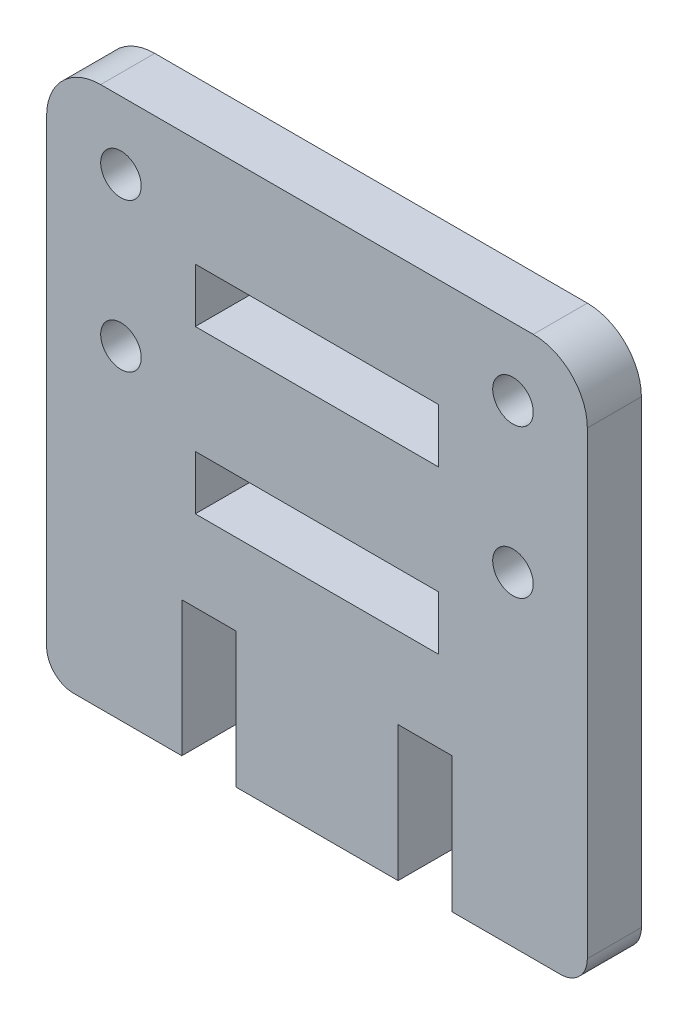
ISO-10303-21;
HEADER;
FILE_DESCRIPTION(('STEP AP214'),'2;1');
FILE_NAME('part.step','',(''),(''),'','','');
FILE_SCHEMA(('AUTOMOTIVE_DESIGN { 1 0 10303 214 1 1 1 1 }'));
ENDSEC;
DATA;
#1=APPLICATION_CONTEXT('core data for automotive mechanical design processes');
#2=APPLICATION_PROTOCOL_DEFINITION('international standard','automotive_design',2000,#1);
#3=PRODUCT_CONTEXT('',#1,'mechanical');
#4=PRODUCT('Part','Part','',(#3));
#5=PRODUCT_RELATED_PRODUCT_CATEGORY('part','',(#4));
#6=PRODUCT_DEFINITION_FORMATION('','',#4);
#7=PRODUCT_DEFINITION_CONTEXT('part definition',#1,'design');
#8=PRODUCT_DEFINITION('design','',#6,#7);
#9=PRODUCT_DEFINITION_SHAPE('','',#8);
#10=(LENGTH_UNIT() NAMED_UNIT(*) SI_UNIT(.MILLI.,.METRE.));
#11=(NAMED_UNIT(*) PLANE_ANGLE_UNIT() SI_UNIT($,.RADIAN.));
#12=(NAMED_UNIT(*) SI_UNIT($,.STERADIAN.) SOLID_ANGLE_UNIT());
#13=UNCERTAINTY_MEASURE_WITH_UNIT(LENGTH_MEASURE(1.E-05),#10,'distance_accuracy_value','');
#14=(GEOMETRIC_REPRESENTATION_CONTEXT(3) GLOBAL_UNCERTAINTY_ASSIGNED_CONTEXT((#13)) GLOBAL_UNIT_ASSIGNED_CONTEXT((#10,
#11,#12)) REPRESENTATION_CONTEXT('',''));
#15=CARTESIAN_POINT('',(0.,0.,0.));
#16=DIRECTION('',(0.,0.,1.));
#17=DIRECTION('',(1.,0.,0.));
#18=AXIS2_PLACEMENT_3D('',#15,#16,#17);
#19=CARTESIAN_POINT('',(1984.10984128656,1167.28470507667,2.));
#20=DIRECTION('',(0.,0.,1.));
#21=DIRECTION('',(1.,0.,0.));
#22=AXIS2_PLACEMENT_3D('',#19,#20,#21);
#23=PLANE('',#22);
#24=DIRECTION('',(1.,0.,0.));
#25=VECTOR('',#24,1.);
#26=CARTESIAN_POINT('',(1970.60984128656,1180.28470507667,2.));
#27=LINE('',#26,#25);
#28=CARTESIAN_POINT('',(1970.60984128656,1180.28470507667,2.));
#29=VERTEX_POINT('',#28);
#30=CARTESIAN_POINT('',(1979.60984128656,1180.28470507667,2.));
#31=VERTEX_POINT('',#30);
#32=EDGE_CURVE('E231',#29,#31,#27,.T.);
#33=ORIENTED_EDGE('',*,*,#32,.F.);
#34=DIRECTION('',(-1.11022302462516E-13,-1.,0.));
#35=VECTOR('',#34,1.);
#36=CARTESIAN_POINT('',(1970.60984128656,1180.28470507667,2.));
#37=LINE('',#36,#35);
#38=CARTESIAN_POINT('',(1970.60984128656,1182.28470507667,2.));
#39=VERTEX_POINT('',#38);
#40=EDGE_CURVE('E229',#39,#29,#37,.T.);
#41=ORIENTED_EDGE('',*,*,#40,.F.);
#42=DIRECTION('',(-1.,0.,0.));
#43=VECTOR('',#42,1.);
#44=CARTESIAN_POINT('',(1970.60984128656,1182.28470507667,2.));
#45=LINE('',#44,#43);
#46=CARTESIAN_POINT('',(1979.60984128656,1182.28470507667,2.));
#47=VERTEX_POINT('',#46);
#48=EDGE_CURVE('E237',#47,#39,#45,.T.);
#49=ORIENTED_EDGE('',*,*,#48,.F.);
#50=DIRECTION('',(0.,1.,0.));
#51=VECTOR('',#50,1.);
#52=CARTESIAN_POINT('',(1979.60984128656,1180.28470507667,2.));
#53=LINE('',#52,#51);
#54=EDGE_CURVE('E234',#31,#47,#53,.T.);
#55=ORIENTED_EDGE('',*,*,#54,.F.);
#56=EDGE_LOOP('',(#33,#41,#49,#55));
#57=FACE_BOUND('',#56,.T.);
#58=CARTESIAN_POINT('',(1982.35984128656,1178.28470507667,2.));
#59=DIRECTION('',(0.,0.,1.));
#60=DIRECTION('',(1.,0.,0.));
#61=AXIS2_PLACEMENT_3D('',#58,#59,#60);
#62=CIRCLE('',#61,0.750000000000028);
#63=CARTESIAN_POINT('',(1983.10984128656,1178.28470507667,2.));
#64=VERTEX_POINT('',#63);
#65=EDGE_CURVE('E266',#64,#64,#62,.T.);
#66=ORIENTED_EDGE('',*,*,#65,.F.);
#67=EDGE_LOOP('',(#66));
#68=FACE_BOUND('',#67,.T.);
#69=CARTESIAN_POINT('',(1982.35984128656,1183.78470507667,2.));
#70=DIRECTION('',(0.,0.,1.));
#71=DIRECTION('',(1.,0.,0.));
#72=AXIS2_PLACEMENT_3D('',#69,#70,#71);
#73=CIRCLE('',#72,0.750000000000028);
#74=CARTESIAN_POINT('',(1983.10984128656,1183.78470507667,2.));
#75=VERTEX_POINT('',#74);
#76=EDGE_CURVE('E278',#75,#75,#73,.T.);
#77=ORIENTED_EDGE('',*,*,#76,.F.);
#78=EDGE_LOOP('',(#77));
#79=FACE_BOUND('',#78,.T.);
#80=CARTESIAN_POINT('',(1984.10984128656,1167.28470507667,2.));
#81=DIRECTION('',(0.,0.,1.));
#82=DIRECTION('',(1.,0.,0.));
#83=AXIS2_PLACEMENT_3D('',#80,#81,#82);
#84=CIRCLE('',#83,1.);
#85=CARTESIAN_POINT('',(1984.10984128656,1166.28470507667,2.));
#86=VERTEX_POINT('',#85);
#87=CARTESIAN_POINT('',(1985.10984128656,1167.28470507667,2.));
#88=VERTEX_POINT('',#87);
#89=EDGE_CURVE('E284',#86,#88,#84,.T.);
#90=ORIENTED_EDGE('',*,*,#89,.T.);
#91=DIRECTION('',(0.,1.,0.));
#92=VECTOR('',#91,1.);
#93=CARTESIAN_POINT('',(1985.10984128656,1184.28470507667,2.));
#94=LINE('',#93,#92);
#95=CARTESIAN_POINT('',(1985.10984128656,1184.28470507667,2.));
#96=VERTEX_POINT('',#95);
#97=EDGE_CURVE('E287',#88,#96,#94,.T.);
#98=ORIENTED_EDGE('',*,*,#97,.T.);
#99=CARTESIAN_POINT('',(1983.10984128656,1184.28470507667,2.));
#100=DIRECTION('',(0.,0.,1.));
#101=DIRECTION('',(1.,0.,0.));
#102=AXIS2_PLACEMENT_3D('',#99,#100,#101);
#103=CIRCLE('',#102,2.00000000000011);
#104=CARTESIAN_POINT('',(1983.10984128656,1186.28470507667,2.));
#105=VERTEX_POINT('',#104);
#106=EDGE_CURVE('E290',#96,#105,#103,.T.);
#107=ORIENTED_EDGE('',*,*,#106,.T.);
#108=DIRECTION('',(-1.,0.,0.));
#109=VECTOR('',#108,1.);
#110=CARTESIAN_POINT('',(1967.10984128656,1186.28470507667,2.));
#111=LINE('',#110,#109);
#112=CARTESIAN_POINT('',(1967.10984128656,1186.28470507667,2.));
#113=VERTEX_POINT('',#112);
#114=EDGE_CURVE('E292',#105,#113,#111,.T.);
#115=ORIENTED_EDGE('',*,*,#114,.T.);
#116=CARTESIAN_POINT('',(1967.10984128656,1184.28470507667,2.));
#117=DIRECTION('',(0.,0.,1.));
#118=DIRECTION('',(1.,0.,0.));
#119=AXIS2_PLACEMENT_3D('',#116,#117,#118);
#120=CIRCLE('',#119,2.);
#121=CARTESIAN_POINT('',(1965.10984128656,1184.28470507667,2.));
#122=VERTEX_POINT('',#121);
#123=EDGE_CURVE('E294',#113,#122,#120,.T.);
#124=ORIENTED_EDGE('',*,*,#123,.T.);
#125=DIRECTION('',(0.,-1.,0.));
#126=VECTOR('',#125,1.);
#127=CARTESIAN_POINT('',(1965.10984128656,1184.28470507667,2.));
#128=LINE('',#127,#126);
#129=CARTESIAN_POINT('',(1965.10984128656,1167.28470507667,2.));
#130=VERTEX_POINT('',#129);
#131=EDGE_CURVE('E296',#122,#130,#128,.T.);
#132=ORIENTED_EDGE('',*,*,#131,.T.);
#133=CARTESIAN_POINT('',(1966.10984128656,1167.28470507667,2.));
#134=DIRECTION('',(0.,0.,1.));
#135=DIRECTION('',(1.,0.,0.));
#136=AXIS2_PLACEMENT_3D('',#133,#134,#135);
#137=CIRCLE('',#136,0.99999999999989);
#138=CARTESIAN_POINT('',(1966.10984128656,1166.28470507667,2.));
#139=VERTEX_POINT('',#138);
#140=EDGE_CURVE('E298',#130,#139,#137,.T.);
#141=ORIENTED_EDGE('',*,*,#140,.T.);
#142=DIRECTION('',(1.,0.,0.));
#143=VECTOR('',#142,1.);
#144=CARTESIAN_POINT('',(1966.10984128656,1166.28470507667,2.));
#145=LINE('',#144,#143);
#146=CARTESIAN_POINT('',(1970.10984128656,1166.28470507667,2.));
#147=VERTEX_POINT('',#146);
#148=EDGE_CURVE('E300',#139,#147,#145,.T.);
#149=ORIENTED_EDGE('',*,*,#148,.T.);
#150=DIRECTION('',(0.,1.,0.));
#151=VECTOR('',#150,1.);
#152=CARTESIAN_POINT('',(1970.10984128656,1171.28470507667,2.));
#153=LINE('',#152,#151);
#154=CARTESIAN_POINT('',(1970.10984128656,1171.28470507667,2.));
#155=VERTEX_POINT('',#154);
#156=EDGE_CURVE('E302',#147,#155,#153,.T.);
#157=ORIENTED_EDGE('',*,*,#156,.T.);
#158=DIRECTION('',(1.,0.,0.));
#159=VECTOR('',#158,1.);
#160=CARTESIAN_POINT('',(1972.10984128656,1171.28470507667,2.));
#161=LINE('',#160,#159);
#162=CARTESIAN_POINT('',(1972.10984128656,1171.28470507667,2.));
#163=VERTEX_POINT('',#162);
#164=EDGE_CURVE('E304',#155,#163,#161,.T.);
#165=ORIENTED_EDGE('',*,*,#164,.T.);
#166=DIRECTION('',(0.,-1.,0.));
#167=VECTOR('',#166,1.);
#168=CARTESIAN_POINT('',(1972.10984128656,1171.28470507667,2.));
#169=LINE('',#168,#167);
#170=CARTESIAN_POINT('',(1972.10984128656,1166.28470507667,2.));
#171=VERTEX_POINT('',#170);
#172=EDGE_CURVE('E306',#163,#171,#169,.T.);
#173=ORIENTED_EDGE('',*,*,#172,.T.);
#174=DIRECTION('',(1.,0.,0.));
#175=VECTOR('',#174,1.);
#176=CARTESIAN_POINT('',(1972.10984128656,1166.28470507667,2.));
#177=LINE('',#176,#175);
#178=CARTESIAN_POINT('',(1978.10984128656,1166.28470507667,2.));
#179=VERTEX_POINT('',#178);
#180=EDGE_CURVE('E308',#171,#179,#177,.T.);
#181=ORIENTED_EDGE('',*,*,#180,.T.);
#182=DIRECTION('',(0.,1.,0.));
#183=VECTOR('',#182,1.);
#184=CARTESIAN_POINT('',(1978.10984128656,1171.28470507667,2.));
#185=LINE('',#184,#183);
#186=CARTESIAN_POINT('',(1978.10984128656,1171.28470507667,2.));
#187=VERTEX_POINT('',#186);
#188=EDGE_CURVE('E310',#179,#187,#185,.T.);
#189=ORIENTED_EDGE('',*,*,#188,.T.);
#190=DIRECTION('',(1.,0.,0.));
#191=VECTOR('',#190,1.);
#192=CARTESIAN_POINT('',(1978.10984128656,1171.28470507667,2.));
#193=LINE('',#192,#191);
#194=CARTESIAN_POINT('',(1980.10984128656,1171.28470507667,2.));
#195=VERTEX_POINT('',#194);
#196=EDGE_CURVE('E312',#187,#195,#193,.T.);
#197=ORIENTED_EDGE('',*,*,#196,.T.);
#198=DIRECTION('',(0.,-1.,0.));
#199=VECTOR('',#198,1.);
#200=CARTESIAN_POINT('',(1980.10984128656,1171.28470507667,2.));
#201=LINE('',#200,#199);
#202=CARTESIAN_POINT('',(1980.10984128656,1166.28470507667,2.));
#203=VERTEX_POINT('',#202);
#204=EDGE_CURVE('E314',#195,#203,#201,.T.);
#205=ORIENTED_EDGE('',*,*,#204,.T.);
#206=DIRECTION('',(1.,0.,0.));
#207=VECTOR('',#206,1.);
#208=CARTESIAN_POINT('',(1980.10984128656,1166.28470507667,2.));
#209=LINE('',#208,#207);
#210=EDGE_CURVE('E316',#203,#86,#209,.T.);
#211=ORIENTED_EDGE('',*,*,#210,.T.);
#212=EDGE_LOOP('',(#90,#98,#107,#115,#124,#132,#141,#149,#157,#165,#173,#181,#189,#197,#205,#211));
#213=FACE_BOUND('',#212,.T.);
#214=CARTESIAN_POINT('',(1967.85984128656,1183.78470507667,2.));
#215=DIRECTION('',(0.,0.,1.));
#216=DIRECTION('',(1.,0.,0.));
#217=AXIS2_PLACEMENT_3D('',#214,#215,#216);
#218=CIRCLE('',#217,0.750000000000028);
#219=CARTESIAN_POINT('',(1968.60984128656,1183.78470507667,2.));
#220=VERTEX_POINT('',#219);
#221=EDGE_CURVE('E272',#220,#220,#218,.T.);
#222=ORIENTED_EDGE('',*,*,#221,.F.);
#223=EDGE_LOOP('',(#222));
#224=FACE_BOUND('',#223,.T.);
#225=CARTESIAN_POINT('',(1967.85984128656,1178.28470507667,2.));
#226=DIRECTION('',(0.,0.,1.));
#227=DIRECTION('',(1.,0.,0.));
#228=AXIS2_PLACEMENT_3D('',#225,#226,#227);
#229=CIRCLE('',#228,0.750000000000028);
#230=CARTESIAN_POINT('',(1968.60984128656,1178.28470507667,2.));
#231=VERTEX_POINT('',#230);
#232=EDGE_CURVE('E260',#231,#231,#229,.T.);
#233=ORIENTED_EDGE('',*,*,#232,.F.);
#234=EDGE_LOOP('',(#233));
#235=FACE_BOUND('',#234,.T.);
#236=DIRECTION('',(1.,0.,0.));
#237=VECTOR('',#236,1.);
#238=CARTESIAN_POINT('',(1970.60984128656,1174.28470507667,2.));
#239=LINE('',#238,#237);
#240=CARTESIAN_POINT('',(1970.60984128656,1174.28470507667,2.));
#241=VERTEX_POINT('',#240);
#242=CARTESIAN_POINT('',(1979.60984128656,1174.28470507667,2.));
#243=VERTEX_POINT('',#242);
#244=EDGE_CURVE('E201',#241,#243,#239,.T.);
#245=ORIENTED_EDGE('',*,*,#244,.F.);
#246=DIRECTION('',(1.11022302462516E-13,-1.,0.));
#247=VECTOR('',#246,1.);
#248=CARTESIAN_POINT('',(1970.60984128656,1174.28470507667,2.));
#249=LINE('',#248,#247);
#250=CARTESIAN_POINT('',(1970.60984128656,1176.28470507667,2.));
#251=VERTEX_POINT('',#250);
#252=EDGE_CURVE('E193',#251,#241,#249,.T.);
#253=ORIENTED_EDGE('',*,*,#252,.F.);
#254=DIRECTION('',(-1.,0.,0.));
#255=VECTOR('',#254,1.);
#256=CARTESIAN_POINT('',(1970.60984128656,1176.28470507667,2.));
#257=LINE('',#256,#255);
#258=CARTESIAN_POINT('',(1979.60984128656,1176.28470507667,2.));
#259=VERTEX_POINT('',#258);
#260=EDGE_CURVE('E215',#259,#251,#257,.T.);
#261=ORIENTED_EDGE('',*,*,#260,.F.);
#262=DIRECTION('',(1.11022302462516E-13,1.,0.));
#263=VECTOR('',#262,1.);
#264=CARTESIAN_POINT('',(1979.60984128656,1174.28470507667,2.));
#265=LINE('',#264,#263);
#266=EDGE_CURVE('E213',#243,#259,#265,.T.);
#267=ORIENTED_EDGE('',*,*,#266,.F.);
#268=EDGE_LOOP('',(#245,#253,#261,#267));
#269=FACE_BOUND('',#268,.T.);
#270=ADVANCED_FACE('F32',(#57,#68,#79,#213,#224,#235,#269),#23,.T.);
#271=CARTESIAN_POINT('',(1984.10984128656,1167.28470507667,0.));
#272=DIRECTION('',(0.,0.,1.));
#273=DIRECTION('',(1.,0.,0.));
#274=AXIS2_PLACEMENT_3D('',#271,#272,#273);
#275=PLANE('',#274);
#276=DIRECTION('',(-1.11022302462516E-13,-1.,0.));
#277=VECTOR('',#276,1.);
#278=CARTESIAN_POINT('',(1970.60984128656,1180.28470507667,0.));
#279=LINE('',#278,#277);
#280=CARTESIAN_POINT('',(1970.60984128656,1182.28470507667,0.));
#281=VERTEX_POINT('',#280);
#282=CARTESIAN_POINT('',(1970.60984128656,1180.28470507667,0.));
#283=VERTEX_POINT('',#282);
#284=EDGE_CURVE('E209',#281,#283,#279,.T.);
#285=ORIENTED_EDGE('',*,*,#284,.T.);
#286=DIRECTION('',(1.,0.,0.));
#287=VECTOR('',#286,1.);
#288=CARTESIAN_POINT('',(1970.60984128656,1180.28470507667,0.));
#289=LINE('',#288,#287);
#290=CARTESIAN_POINT('',(1979.60984128656,1180.28470507667,0.));
#291=VERTEX_POINT('',#290);
#292=EDGE_CURVE('E242',#283,#291,#289,.T.);
#293=ORIENTED_EDGE('',*,*,#292,.T.);
#294=DIRECTION('',(0.,1.,0.));
#295=VECTOR('',#294,1.);
#296=CARTESIAN_POINT('',(1979.60984128656,1180.28470507667,0.));
#297=LINE('',#296,#295);
#298=CARTESIAN_POINT('',(1979.60984128656,1182.28470507667,0.));
#299=VERTEX_POINT('',#298);
#300=EDGE_CURVE('E245',#291,#299,#297,.T.);
#301=ORIENTED_EDGE('',*,*,#300,.T.);
#302=DIRECTION('',(-1.,0.,0.));
#303=VECTOR('',#302,1.);
#304=CARTESIAN_POINT('',(1970.60984128656,1182.28470507667,0.));
#305=LINE('',#304,#303);
#306=EDGE_CURVE('E232',#299,#281,#305,.T.);
#307=ORIENTED_EDGE('',*,*,#306,.T.);
#308=EDGE_LOOP('',(#285,#293,#301,#307));
#309=FACE_BOUND('',#308,.T.);
#310=CARTESIAN_POINT('',(1982.35984128656,1178.28470507667,0.));
#311=DIRECTION('',(0.,0.,1.));
#312=DIRECTION('',(1.,0.,0.));
#313=AXIS2_PLACEMENT_3D('',#310,#311,#312);
#314=CIRCLE('',#313,0.750000000000028);
#315=CARTESIAN_POINT('',(1983.10984128656,1178.28470507667,0.));
#316=VERTEX_POINT('',#315);
#317=EDGE_CURVE('E263',#316,#316,#314,.T.);
#318=ORIENTED_EDGE('',*,*,#317,.T.);
#319=EDGE_LOOP('',(#318));
#320=FACE_BOUND('',#319,.T.);
#321=CARTESIAN_POINT('',(1982.35984128656,1183.78470507667,0.));
#322=DIRECTION('',(0.,0.,1.));
#323=DIRECTION('',(1.,0.,0.));
#324=AXIS2_PLACEMENT_3D('',#321,#322,#323);
#325=CIRCLE('',#324,0.750000000000028);
#326=CARTESIAN_POINT('',(1983.10984128656,1183.78470507667,0.));
#327=VERTEX_POINT('',#326);
#328=EDGE_CURVE('E275',#327,#327,#325,.T.);
#329=ORIENTED_EDGE('',*,*,#328,.T.);
#330=EDGE_LOOP('',(#329));
#331=FACE_BOUND('',#330,.T.);
#332=CARTESIAN_POINT('',(1984.10984128656,1167.28470507667,0.));
#333=DIRECTION('',(0.,0.,1.));
#334=DIRECTION('',(1.,0.,0.));
#335=AXIS2_PLACEMENT_3D('',#332,#333,#334);
#336=CIRCLE('',#335,1.);
#337=CARTESIAN_POINT('',(1984.10984128656,1166.28470507667,0.));
#338=VERTEX_POINT('',#337);
#339=CARTESIAN_POINT('',(1985.10984128656,1167.28470507667,0.));
#340=VERTEX_POINT('',#339);
#341=EDGE_CURVE('E281',#338,#340,#336,.T.);
#342=ORIENTED_EDGE('',*,*,#341,.F.);
#343=DIRECTION('',(1.,0.,0.));
#344=VECTOR('',#343,1.);
#345=CARTESIAN_POINT('',(1980.10984128656,1166.28470507667,0.));
#346=LINE('',#345,#344);
#347=CARTESIAN_POINT('',(1980.10984128656,1166.28470507667,0.));
#348=VERTEX_POINT('',#347);
#349=EDGE_CURVE('E288',#348,#338,#346,.T.);
#350=ORIENTED_EDGE('',*,*,#349,.F.);
#351=DIRECTION('',(0.,-1.,0.));
#352=VECTOR('',#351,1.);
#353=CARTESIAN_POINT('',(1980.10984128656,1171.28470507667,0.));
#354=LINE('',#353,#352);
#355=CARTESIAN_POINT('',(1980.10984128656,1171.28470507667,0.));
#356=VERTEX_POINT('',#355);
#357=EDGE_CURVE('E347',#356,#348,#354,.T.);
#358=ORIENTED_EDGE('',*,*,#357,.F.);
#359=DIRECTION('',(1.,0.,0.));
#360=VECTOR('',#359,1.);
#361=CARTESIAN_POINT('',(1978.10984128656,1171.28470507667,0.));
#362=LINE('',#361,#360);
#363=CARTESIAN_POINT('',(1978.10984128656,1171.28470507667,0.));
#364=VERTEX_POINT('',#363);
#365=EDGE_CURVE('E345',#364,#356,#362,.T.);
#366=ORIENTED_EDGE('',*,*,#365,.F.);
#367=DIRECTION('',(0.,1.,0.));
#368=VECTOR('',#367,1.);
#369=CARTESIAN_POINT('',(1978.10984128656,1171.28470507667,0.));
#370=LINE('',#369,#368);
#371=CARTESIAN_POINT('',(1978.10984128656,1166.28470507667,0.));
#372=VERTEX_POINT('',#371);
#373=EDGE_CURVE('E343',#372,#364,#370,.T.);
#374=ORIENTED_EDGE('',*,*,#373,.F.);
#375=DIRECTION('',(1.,0.,0.));
#376=VECTOR('',#375,1.);
#377=CARTESIAN_POINT('',(1972.10984128656,1166.28470507667,0.));
#378=LINE('',#377,#376);
#379=CARTESIAN_POINT('',(1972.10984128656,1166.28470507667,0.));
#380=VERTEX_POINT('',#379);
#381=EDGE_CURVE('E341',#380,#372,#378,.T.);
#382=ORIENTED_EDGE('',*,*,#381,.F.);
#383=DIRECTION('',(0.,-1.,0.));
#384=VECTOR('',#383,1.);
#385=CARTESIAN_POINT('',(1972.10984128656,1171.28470507667,0.));
#386=LINE('',#385,#384);
#387=CARTESIAN_POINT('',(1972.10984128656,1171.28470507667,0.));
#388=VERTEX_POINT('',#387);
#389=EDGE_CURVE('E339',#388,#380,#386,.T.);
#390=ORIENTED_EDGE('',*,*,#389,.F.);
#391=DIRECTION('',(1.,0.,0.));
#392=VECTOR('',#391,1.);
#393=CARTESIAN_POINT('',(1972.10984128656,1171.28470507667,0.));
#394=LINE('',#393,#392);
#395=CARTESIAN_POINT('',(1970.10984128656,1171.28470507667,0.));
#396=VERTEX_POINT('',#395);
#397=EDGE_CURVE('E337',#396,#388,#394,.T.);
#398=ORIENTED_EDGE('',*,*,#397,.F.);
#399=DIRECTION('',(0.,1.,0.));
#400=VECTOR('',#399,1.);
#401=CARTESIAN_POINT('',(1970.10984128656,1171.28470507667,0.));
#402=LINE('',#401,#400);
#403=CARTESIAN_POINT('',(1970.10984128656,1166.28470507667,0.));
#404=VERTEX_POINT('',#403);
#405=EDGE_CURVE('E335',#404,#396,#402,.T.);
#406=ORIENTED_EDGE('',*,*,#405,.F.);
#407=DIRECTION('',(1.,0.,0.));
#408=VECTOR('',#407,1.);
#409=CARTESIAN_POINT('',(1966.10984128656,1166.28470507667,0.));
#410=LINE('',#409,#408);
#411=CARTESIAN_POINT('',(1966.10984128656,1166.28470507667,0.));
#412=VERTEX_POINT('',#411);
#413=EDGE_CURVE('E333',#412,#404,#410,.T.);
#414=ORIENTED_EDGE('',*,*,#413,.F.);
#415=CARTESIAN_POINT('',(1966.10984128656,1167.28470507667,0.));
#416=DIRECTION('',(0.,0.,1.));
#417=DIRECTION('',(1.,0.,0.));
#418=AXIS2_PLACEMENT_3D('',#415,#416,#417);
#419=CIRCLE('',#418,0.99999999999989);
#420=CARTESIAN_POINT('',(1965.10984128656,1167.28470507667,0.));
#421=VERTEX_POINT('',#420);
#422=EDGE_CURVE('E331',#421,#412,#419,.T.);
#423=ORIENTED_EDGE('',*,*,#422,.F.);
#424=DIRECTION('',(0.,-1.,0.));
#425=VECTOR('',#424,1.);
#426=CARTESIAN_POINT('',(1965.10984128656,1184.28470507667,0.));
#427=LINE('',#426,#425);
#428=CARTESIAN_POINT('',(1965.10984128656,1184.28470507667,0.));
#429=VERTEX_POINT('',#428);
#430=EDGE_CURVE('E329',#429,#421,#427,.T.);
#431=ORIENTED_EDGE('',*,*,#430,.F.);
#432=CARTESIAN_POINT('',(1967.10984128656,1184.28470507667,0.));
#433=DIRECTION('',(0.,0.,1.));
#434=DIRECTION('',(1.,0.,0.));
#435=AXIS2_PLACEMENT_3D('',#432,#433,#434);
#436=CIRCLE('',#435,2.);
#437=CARTESIAN_POINT('',(1967.10984128656,1186.28470507667,0.));
#438=VERTEX_POINT('',#437);
#439=EDGE_CURVE('E327',#438,#429,#436,.T.);
#440=ORIENTED_EDGE('',*,*,#439,.F.);
#441=DIRECTION('',(-1.,0.,0.));
#442=VECTOR('',#441,1.);
#443=CARTESIAN_POINT('',(1967.10984128656,1186.28470507667,0.));
#444=LINE('',#443,#442);
#445=CARTESIAN_POINT('',(1983.10984128656,1186.28470507667,0.));
#446=VERTEX_POINT('',#445);
#447=EDGE_CURVE('E325',#446,#438,#444,.T.);
#448=ORIENTED_EDGE('',*,*,#447,.F.);
#449=CARTESIAN_POINT('',(1983.10984128656,1184.28470507667,0.));
#450=DIRECTION('',(0.,0.,1.));
#451=DIRECTION('',(1.,0.,0.));
#452=AXIS2_PLACEMENT_3D('',#449,#450,#451);
#453=CIRCLE('',#452,2.00000000000011);
#454=CARTESIAN_POINT('',(1985.10984128656,1184.28470507667,0.));
#455=VERTEX_POINT('',#454);
#456=EDGE_CURVE('E323',#455,#446,#453,.T.);
#457=ORIENTED_EDGE('',*,*,#456,.F.);
#458=DIRECTION('',(0.,1.,0.));
#459=VECTOR('',#458,1.);
#460=CARTESIAN_POINT('',(1985.10984128656,1184.28470507667,0.));
#461=LINE('',#460,#459);
#462=EDGE_CURVE('E321',#340,#455,#461,.T.);
#463=ORIENTED_EDGE('',*,*,#462,.F.);
#464=EDGE_LOOP('',(#342,#350,#358,#366,#374,#382,#390,#398,#406,#414,#423,#431,#440,#448,#457,#463));
#465=FACE_BOUND('',#464,.T.);
#466=CARTESIAN_POINT('',(1967.85984128656,1183.78470507667,0.));
#467=DIRECTION('',(0.,0.,1.));
#468=DIRECTION('',(1.,0.,0.));
#469=AXIS2_PLACEMENT_3D('',#466,#467,#468);
#470=CIRCLE('',#469,0.750000000000028);
#471=CARTESIAN_POINT('',(1968.60984128656,1183.78470507667,0.));
#472=VERTEX_POINT('',#471);
#473=EDGE_CURVE('E269',#472,#472,#470,.T.);
#474=ORIENTED_EDGE('',*,*,#473,.T.);
#475=EDGE_LOOP('',(#474));
#476=FACE_BOUND('',#475,.T.);
#477=CARTESIAN_POINT('',(1967.85984128656,1178.28470507667,0.));
#478=DIRECTION('',(0.,0.,1.));
#479=DIRECTION('',(1.,0.,0.));
#480=AXIS2_PLACEMENT_3D('',#477,#478,#479);
#481=CIRCLE('',#480,0.750000000000028);
#482=CARTESIAN_POINT('',(1968.60984128656,1178.28470507667,0.));
#483=VERTEX_POINT('',#482);
#484=EDGE_CURVE('E259',#483,#483,#481,.T.);
#485=ORIENTED_EDGE('',*,*,#484,.T.);
#486=EDGE_LOOP('',(#485));
#487=FACE_BOUND('',#486,.T.);
#488=DIRECTION('',(1.11022302462516E-13,-1.,0.));
#489=VECTOR('',#488,1.);
#490=CARTESIAN_POINT('',(1970.60984128656,1174.28470507667,0.));
#491=LINE('',#490,#489);
#492=CARTESIAN_POINT('',(1970.60984128656,1176.28470507667,0.));
#493=VERTEX_POINT('',#492);
#494=CARTESIAN_POINT('',(1970.60984128656,1174.28470507667,0.));
#495=VERTEX_POINT('',#494);
#496=EDGE_CURVE('E55',#493,#495,#491,.T.);
#497=ORIENTED_EDGE('',*,*,#496,.T.);
#498=DIRECTION('',(1.,0.,0.));
#499=VECTOR('',#498,1.);
#500=CARTESIAN_POINT('',(1970.60984128656,1174.28470507667,0.));
#501=LINE('',#500,#499);
#502=CARTESIAN_POINT('',(1979.60984128656,1174.28470507667,0.));
#503=VERTEX_POINT('',#502);
#504=EDGE_CURVE('E208',#495,#503,#501,.T.);
#505=ORIENTED_EDGE('',*,*,#504,.T.);
#506=DIRECTION('',(1.11022302462516E-13,1.,0.));
#507=VECTOR('',#506,1.);
#508=CARTESIAN_POINT('',(1979.60984128656,1174.28470507667,0.));
#509=LINE('',#508,#507);
#510=CARTESIAN_POINT('',(1979.60984128656,1176.28470507667,0.));
#511=VERTEX_POINT('',#510);
#512=EDGE_CURVE('E221',#503,#511,#509,.T.);
#513=ORIENTED_EDGE('',*,*,#512,.T.);
#514=DIRECTION('',(-1.,0.,0.));
#515=VECTOR('',#514,1.);
#516=CARTESIAN_POINT('',(1970.60984128656,1176.28470507667,0.));
#517=LINE('',#516,#515);
#518=EDGE_CURVE('E202',#511,#493,#517,.T.);
#519=ORIENTED_EDGE('',*,*,#518,.T.);
#520=EDGE_LOOP('',(#497,#505,#513,#519));
#521=FACE_BOUND('',#520,.T.);
#522=ADVANCED_FACE('F401',(#309,#320,#331,#465,#476,#487,#521),#275,.F.);
#523=CARTESIAN_POINT('',(1984.10984128656,1167.28470507667,2.));
#524=DIRECTION('',(0.,0.,-1.));
#525=DIRECTION('',(-1.,0.,0.));
#526=AXIS2_PLACEMENT_3D('',#523,#524,#525);
#527=CYLINDRICAL_SURFACE('',#526,1.);
#528=ORIENTED_EDGE('',*,*,#341,.T.);
#529=DIRECTION('',(0.,0.,-1.));
#530=VECTOR('',#529,1.);
#531=CARTESIAN_POINT('',(1985.10984128656,1167.28470507667,2.));
#532=LINE('',#531,#530);
#533=EDGE_CURVE('E11',#88,#340,#532,.T.);
#534=ORIENTED_EDGE('',*,*,#533,.F.);
#535=ORIENTED_EDGE('',*,*,#89,.F.);
#536=DIRECTION('',(0.,0.,-1.));
#537=VECTOR('',#536,1.);
#538=CARTESIAN_POINT('',(1984.10984128656,1166.28470507667,2.));
#539=LINE('',#538,#537);
#540=EDGE_CURVE('E318',#86,#338,#539,.T.);
#541=ORIENTED_EDGE('',*,*,#540,.T.);
#542=EDGE_LOOP('',(#528,#534,#535,#541));
#543=FACE_BOUND('',#542,.T.);
#544=ADVANCED_FACE('F34',(#543),#527,.T.);
#545=CARTESIAN_POINT('',(1985.10984128656,1184.28470507667,2.));
#546=DIRECTION('',(-1.,0.,0.));
#547=DIRECTION('',(0.,-1.,0.));
#548=AXIS2_PLACEMENT_3D('',#545,#546,#547);
#549=PLANE('',#548);
#550=ORIENTED_EDGE('',*,*,#462,.T.);
#551=DIRECTION('',(0.,0.,-1.));
#552=VECTOR('',#551,1.);
#553=CARTESIAN_POINT('',(1985.10984128656,1184.28470507667,2.));
#554=LINE('',#553,#552);
#555=EDGE_CURVE('E40',#96,#455,#554,.T.);
#556=ORIENTED_EDGE('',*,*,#555,.F.);
#557=ORIENTED_EDGE('',*,*,#97,.F.);
#558=ORIENTED_EDGE('',*,*,#533,.T.);
#559=EDGE_LOOP('',(#550,#556,#557,#558));
#560=FACE_BOUND('',#559,.T.);
#561=ADVANCED_FACE('F419',(#560),#549,.F.);
#562=CARTESIAN_POINT('',(1983.10984128656,1184.28470507667,2.));
#563=DIRECTION('',(0.,0.,-1.));
#564=DIRECTION('',(-1.,0.,0.));
#565=AXIS2_PLACEMENT_3D('',#562,#563,#564);
#566=CYLINDRICAL_SURFACE('',#565,2.00000000000011);
#567=ORIENTED_EDGE('',*,*,#456,.T.);
#568=DIRECTION('',(0.,0.,-1.));
#569=VECTOR('',#568,1.);
#570=CARTESIAN_POINT('',(1983.10984128656,1186.28470507667,2.));
#571=LINE('',#570,#569);
#572=EDGE_CURVE('E388',#105,#446,#571,.T.);
#573=ORIENTED_EDGE('',*,*,#572,.F.);
#574=ORIENTED_EDGE('',*,*,#106,.F.);
#575=ORIENTED_EDGE('',*,*,#555,.T.);
#576=EDGE_LOOP('',(#567,#573,#574,#575));
#577=FACE_BOUND('',#576,.T.);
#578=ADVANCED_FACE('F395',(#577),#566,.T.);
#579=CARTESIAN_POINT('',(1967.10984128656,1186.28470507667,2.));
#580=DIRECTION('',(0.,-1.,0.));
#581=DIRECTION('',(0.,0.,-1.));
#582=AXIS2_PLACEMENT_3D('',#579,#580,#581);
#583=PLANE('',#582);
#584=ORIENTED_EDGE('',*,*,#447,.T.);
#585=DIRECTION('',(0.,0.,-1.));
#586=VECTOR('',#585,1.);
#587=CARTESIAN_POINT('',(1967.10984128656,1186.28470507667,2.));
#588=LINE('',#587,#586);
#589=EDGE_CURVE('E385',#113,#438,#588,.T.);
#590=ORIENTED_EDGE('',*,*,#589,.F.);
#591=ORIENTED_EDGE('',*,*,#114,.F.);
#592=ORIENTED_EDGE('',*,*,#572,.T.);
#593=EDGE_LOOP('',(#584,#590,#591,#592));
#594=FACE_BOUND('',#593,.T.);
#595=ADVANCED_FACE('F407',(#594),#583,.F.);
#596=CARTESIAN_POINT('',(1967.10984128656,1184.28470507667,2.));
#597=DIRECTION('',(0.,0.,-1.));
#598=DIRECTION('',(-1.,0.,0.));
#599=AXIS2_PLACEMENT_3D('',#596,#597,#598);
#600=CYLINDRICAL_SURFACE('',#599,2.);
#601=ORIENTED_EDGE('',*,*,#439,.T.);
#602=DIRECTION('',(0.,0.,-1.));
#603=VECTOR('',#602,1.);
#604=CARTESIAN_POINT('',(1965.10984128656,1184.28470507667,2.));
#605=LINE('',#604,#603);
#606=EDGE_CURVE('E382',#122,#429,#605,.T.);
#607=ORIENTED_EDGE('',*,*,#606,.F.);
#608=ORIENTED_EDGE('',*,*,#123,.F.);
#609=ORIENTED_EDGE('',*,*,#589,.T.);
#610=EDGE_LOOP('',(#601,#607,#608,#609));
#611=FACE_BOUND('',#610,.T.);
#612=ADVANCED_FACE('F411',(#611),#600,.T.);
#613=CARTESIAN_POINT('',(1965.10984128656,1184.28470507667,2.));
#614=DIRECTION('',(1.,0.,0.));
#615=DIRECTION('',(0.,1.,0.));
#616=AXIS2_PLACEMENT_3D('',#613,#614,#615);
#617=PLANE('',#616);
#618=ORIENTED_EDGE('',*,*,#430,.T.);
#619=DIRECTION('',(0.,0.,-1.));
#620=VECTOR('',#619,1.);
#621=CARTESIAN_POINT('',(1965.10984128656,1167.28470507667,2.));
#622=LINE('',#621,#620);
#623=EDGE_CURVE('E379',#130,#421,#622,.T.);
#624=ORIENTED_EDGE('',*,*,#623,.F.);
#625=ORIENTED_EDGE('',*,*,#131,.F.);
#626=ORIENTED_EDGE('',*,*,#606,.T.);
#627=EDGE_LOOP('',(#618,#624,#625,#626));
#628=FACE_BOUND('',#627,.T.);
#629=ADVANCED_FACE('F472',(#628),#617,.F.);
#630=CARTESIAN_POINT('',(1966.10984128656,1167.28470507667,2.));
#631=DIRECTION('',(0.,0.,-1.));
#632=DIRECTION('',(-1.,0.,0.));
#633=AXIS2_PLACEMENT_3D('',#630,#631,#632);
#634=CYLINDRICAL_SURFACE('',#633,0.99999999999989);
#635=ORIENTED_EDGE('',*,*,#422,.T.);
#636=DIRECTION('',(0.,0.,-1.));
#637=VECTOR('',#636,1.);
#638=CARTESIAN_POINT('',(1966.10984128656,1166.28470507667,2.));
#639=LINE('',#638,#637);
#640=EDGE_CURVE('E376',#139,#412,#639,.T.);
#641=ORIENTED_EDGE('',*,*,#640,.F.);
#642=ORIENTED_EDGE('',*,*,#140,.F.);
#643=ORIENTED_EDGE('',*,*,#623,.T.);
#644=EDGE_LOOP('',(#635,#641,#642,#643));
#645=FACE_BOUND('',#644,.T.);
#646=ADVANCED_FACE('F469',(#645),#634,.T.);
#647=CARTESIAN_POINT('',(1966.10984128656,1166.28470507667,2.));
#648=DIRECTION('',(0.,1.,0.));
#649=DIRECTION('',(0.,0.,1.));
#650=AXIS2_PLACEMENT_3D('',#647,#648,#649);
#651=PLANE('',#650);
#652=ORIENTED_EDGE('',*,*,#413,.T.);
#653=DIRECTION('',(0.,0.,-1.));
#654=VECTOR('',#653,1.);
#655=CARTESIAN_POINT('',(1970.10984128656,1166.28470507667,2.));
#656=LINE('',#655,#654);
#657=EDGE_CURVE('E373',#147,#404,#656,.T.);
#658=ORIENTED_EDGE('',*,*,#657,.F.);
#659=ORIENTED_EDGE('',*,*,#148,.F.);
#660=ORIENTED_EDGE('',*,*,#640,.T.);
#661=EDGE_LOOP('',(#652,#658,#659,#660));
#662=FACE_BOUND('',#661,.T.);
#663=ADVANCED_FACE('F465',(#662),#651,.F.);
#664=CARTESIAN_POINT('',(1970.10984128656,1171.28470507667,2.));
#665=DIRECTION('',(-1.,0.,0.));
#666=DIRECTION('',(0.,-1.,0.));
#667=AXIS2_PLACEMENT_3D('',#664,#665,#666);
#668=PLANE('',#667);
#669=ORIENTED_EDGE('',*,*,#405,.T.);
#670=DIRECTION('',(0.,0.,-1.));
#671=VECTOR('',#670,1.);
#672=CARTESIAN_POINT('',(1970.10984128656,1171.28470507667,2.));
#673=LINE('',#672,#671);
#674=EDGE_CURVE('E370',#155,#396,#673,.T.);
#675=ORIENTED_EDGE('',*,*,#674,.F.);
#676=ORIENTED_EDGE('',*,*,#156,.F.);
#677=ORIENTED_EDGE('',*,*,#657,.T.);
#678=EDGE_LOOP('',(#669,#675,#676,#677));
#679=FACE_BOUND('',#678,.T.);
#680=ADVANCED_FACE('F461',(#679),#668,.F.);
#681=CARTESIAN_POINT('',(1972.10984128656,1171.28470507667,2.));
#682=DIRECTION('',(0.,1.,0.));
#683=DIRECTION('',(0.,0.,1.));
#684=AXIS2_PLACEMENT_3D('',#681,#682,#683);
#685=PLANE('',#684);
#686=ORIENTED_EDGE('',*,*,#397,.T.);
#687=DIRECTION('',(0.,0.,-1.));
#688=VECTOR('',#687,1.);
#689=CARTESIAN_POINT('',(1972.10984128656,1171.28470507667,2.));
#690=LINE('',#689,#688);
#691=EDGE_CURVE('E367',#163,#388,#690,.T.);
#692=ORIENTED_EDGE('',*,*,#691,.F.);
#693=ORIENTED_EDGE('',*,*,#164,.F.);
#694=ORIENTED_EDGE('',*,*,#674,.T.);
#695=EDGE_LOOP('',(#686,#692,#693,#694));
#696=FACE_BOUND('',#695,.T.);
#697=ADVANCED_FACE('F456',(#696),#685,.F.);
#698=CARTESIAN_POINT('',(1972.10984128656,1171.28470507667,2.));
#699=DIRECTION('',(1.,0.,0.));
#700=DIRECTION('',(0.,0.,-1.));
#701=AXIS2_PLACEMENT_3D('',#698,#699,#700);
#702=PLANE('',#701);
#703=ORIENTED_EDGE('',*,*,#389,.T.);
#704=DIRECTION('',(0.,0.,-1.));
#705=VECTOR('',#704,1.);
#706=CARTESIAN_POINT('',(1972.10984128656,1166.28470507667,2.));
#707=LINE('',#706,#705);
#708=EDGE_CURVE('E364',#171,#380,#707,.T.);
#709=ORIENTED_EDGE('',*,*,#708,.F.);
#710=ORIENTED_EDGE('',*,*,#172,.F.);
#711=ORIENTED_EDGE('',*,*,#691,.T.);
#712=EDGE_LOOP('',(#703,#709,#710,#711));
#713=FACE_BOUND('',#712,.T.);
#714=ADVANCED_FACE('F450',(#713),#702,.F.);
#715=CARTESIAN_POINT('',(1972.10984128656,1166.28470507667,2.));
#716=DIRECTION('',(0.,1.,0.));
#717=DIRECTION('',(0.,0.,1.));
#718=AXIS2_PLACEMENT_3D('',#715,#716,#717);
#719=PLANE('',#718);
#720=ORIENTED_EDGE('',*,*,#381,.T.);
#721=DIRECTION('',(0.,0.,-1.));
#722=VECTOR('',#721,1.);
#723=CARTESIAN_POINT('',(1978.10984128656,1166.28470507667,2.));
#724=LINE('',#723,#722);
#725=EDGE_CURVE('E361',#179,#372,#724,.T.);
#726=ORIENTED_EDGE('',*,*,#725,.F.);
#727=ORIENTED_EDGE('',*,*,#180,.F.);
#728=ORIENTED_EDGE('',*,*,#708,.T.);
#729=EDGE_LOOP('',(#720,#726,#727,#728));
#730=FACE_BOUND('',#729,.T.);
#731=ADVANCED_FACE('F446',(#730),#719,.F.);
#732=CARTESIAN_POINT('',(1978.10984128656,1171.28470507667,2.));
#733=DIRECTION('',(-1.,0.,0.));
#734=DIRECTION('',(0.,0.,1.));
#735=AXIS2_PLACEMENT_3D('',#732,#733,#734);
#736=PLANE('',#735);
#737=ORIENTED_EDGE('',*,*,#373,.T.);
#738=DIRECTION('',(0.,0.,-1.));
#739=VECTOR('',#738,1.);
#740=CARTESIAN_POINT('',(1978.10984128656,1171.28470507667,2.));
#741=LINE('',#740,#739);
#742=EDGE_CURVE('E358',#187,#364,#741,.T.);
#743=ORIENTED_EDGE('',*,*,#742,.F.);
#744=ORIENTED_EDGE('',*,*,#188,.F.);
#745=ORIENTED_EDGE('',*,*,#725,.T.);
#746=EDGE_LOOP('',(#737,#743,#744,#745));
#747=FACE_BOUND('',#746,.T.);
#748=ADVANCED_FACE('F441',(#747),#736,.F.);
#749=CARTESIAN_POINT('',(1978.10984128656,1171.28470507667,2.));
#750=DIRECTION('',(0.,1.,0.));
#751=DIRECTION('',(0.,0.,1.));
#752=AXIS2_PLACEMENT_3D('',#749,#750,#751);
#753=PLANE('',#752);
#754=ORIENTED_EDGE('',*,*,#365,.T.);
#755=DIRECTION('',(0.,0.,-1.));
#756=VECTOR('',#755,1.);
#757=CARTESIAN_POINT('',(1980.10984128656,1171.28470507667,2.));
#758=LINE('',#757,#756);
#759=EDGE_CURVE('E355',#195,#356,#758,.T.);
#760=ORIENTED_EDGE('',*,*,#759,.F.);
#761=ORIENTED_EDGE('',*,*,#196,.F.);
#762=ORIENTED_EDGE('',*,*,#742,.T.);
#763=EDGE_LOOP('',(#754,#760,#761,#762));
#764=FACE_BOUND('',#763,.T.);
#765=ADVANCED_FACE('F435',(#764),#753,.F.);
#766=CARTESIAN_POINT('',(1980.10984128656,1171.28470507667,2.));
#767=DIRECTION('',(1.,0.,0.));
#768=DIRECTION('',(0.,0.,-1.));
#769=AXIS2_PLACEMENT_3D('',#766,#767,#768);
#770=PLANE('',#769);
#771=ORIENTED_EDGE('',*,*,#357,.T.);
#772=DIRECTION('',(0.,0.,-1.));
#773=VECTOR('',#772,1.);
#774=CARTESIAN_POINT('',(1980.10984128656,1166.28470507667,2.));
#775=LINE('',#774,#773);
#776=EDGE_CURVE('E352',#203,#348,#775,.T.);
#777=ORIENTED_EDGE('',*,*,#776,.F.);
#778=ORIENTED_EDGE('',*,*,#204,.F.);
#779=ORIENTED_EDGE('',*,*,#759,.T.);
#780=EDGE_LOOP('',(#771,#777,#778,#779));
#781=FACE_BOUND('',#780,.T.);
#782=ADVANCED_FACE('F431',(#781),#770,.F.);
#783=CARTESIAN_POINT('',(1980.10984128656,1166.28470507667,2.));
#784=DIRECTION('',(0.,1.,0.));
#785=DIRECTION('',(0.,0.,1.));
#786=AXIS2_PLACEMENT_3D('',#783,#784,#785);
#787=PLANE('',#786);
#788=ORIENTED_EDGE('',*,*,#349,.T.);
#789=ORIENTED_EDGE('',*,*,#540,.F.);
#790=ORIENTED_EDGE('',*,*,#210,.F.);
#791=ORIENTED_EDGE('',*,*,#776,.T.);
#792=EDGE_LOOP('',(#788,#789,#790,#791));
#793=FACE_BOUND('',#792,.T.);
#794=ADVANCED_FACE('F426',(#793),#787,.F.);
#795=CARTESIAN_POINT('',(1982.35984128656,1183.78470507667,2.));
#796=DIRECTION('',(0.,0.,-1.));
#797=DIRECTION('',(-1.,0.,0.));
#798=AXIS2_PLACEMENT_3D('',#795,#796,#797);
#799=CYLINDRICAL_SURFACE('',#798,0.750000000000028);
#800=ORIENTED_EDGE('',*,*,#76,.T.);
#801=EDGE_LOOP('',(#800));
#802=FACE_BOUND('',#801,.T.);
#803=ORIENTED_EDGE('',*,*,#328,.F.);
#804=EDGE_LOOP('',(#803));
#805=FACE_BOUND('',#804,.T.);
#806=ADVANCED_FACE('F492',(#802,#805),#799,.F.);
#807=CARTESIAN_POINT('',(1967.85984128656,1183.78470507667,2.));
#808=DIRECTION('',(0.,0.,-1.));
#809=DIRECTION('',(-1.,0.,0.));
#810=AXIS2_PLACEMENT_3D('',#807,#808,#809);
#811=CYLINDRICAL_SURFACE('',#810,0.750000000000028);
#812=ORIENTED_EDGE('',*,*,#221,.T.);
#813=EDGE_LOOP('',(#812));
#814=FACE_BOUND('',#813,.T.);
#815=ORIENTED_EDGE('',*,*,#473,.F.);
#816=EDGE_LOOP('',(#815));
#817=FACE_BOUND('',#816,.T.);
#818=ADVANCED_FACE('F554',(#814,#817),#811,.F.);
#819=CARTESIAN_POINT('',(1982.35984128656,1178.28470507667,2.));
#820=DIRECTION('',(0.,0.,-1.));
#821=DIRECTION('',(-1.,0.,0.));
#822=AXIS2_PLACEMENT_3D('',#819,#820,#821);
#823=CYLINDRICAL_SURFACE('',#822,0.750000000000028);
#824=ORIENTED_EDGE('',*,*,#65,.T.);
#825=EDGE_LOOP('',(#824));
#826=FACE_BOUND('',#825,.T.);
#827=ORIENTED_EDGE('',*,*,#317,.F.);
#828=EDGE_LOOP('',(#827));
#829=FACE_BOUND('',#828,.T.);
#830=ADVANCED_FACE('F561',(#826,#829),#823,.F.);
#831=CARTESIAN_POINT('',(1967.85984128656,1178.28470507667,2.));
#832=DIRECTION('',(0.,0.,-1.));
#833=DIRECTION('',(-1.,0.,0.));
#834=AXIS2_PLACEMENT_3D('',#831,#832,#833);
#835=CYLINDRICAL_SURFACE('',#834,0.750000000000028);
#836=ORIENTED_EDGE('',*,*,#232,.T.);
#837=EDGE_LOOP('',(#836));
#838=FACE_BOUND('',#837,.T.);
#839=ORIENTED_EDGE('',*,*,#484,.F.);
#840=EDGE_LOOP('',(#839));
#841=FACE_BOUND('',#840,.T.);
#842=ADVANCED_FACE('F568',(#838,#841),#835,.F.);
#843=CARTESIAN_POINT('',(1970.60984128656,1180.28470507667,2.));
#844=DIRECTION('',(1.,-1.11022302462516E-13,0.));
#845=DIRECTION('',(1.11022302462516E-13,1.,0.));
#846=AXIS2_PLACEMENT_3D('',#843,#844,#845);
#847=PLANE('',#846);
#848=ORIENTED_EDGE('',*,*,#284,.F.);
#849=DIRECTION('',(0.,0.,-1.));
#850=VECTOR('',#849,1.);
#851=CARTESIAN_POINT('',(1970.60984128656,1182.28470507667,2.));
#852=LINE('',#851,#850);
#853=EDGE_CURVE('E239',#39,#281,#852,.T.);
#854=ORIENTED_EDGE('',*,*,#853,.F.);
#855=ORIENTED_EDGE('',*,*,#40,.T.);
#856=DIRECTION('',(0.,0.,-1.));
#857=VECTOR('',#856,1.);
#858=CARTESIAN_POINT('',(1970.60984128656,1180.28470507667,2.));
#859=LINE('',#858,#857);
#860=EDGE_CURVE('E256',#29,#283,#859,.T.);
#861=ORIENTED_EDGE('',*,*,#860,.T.);
#862=EDGE_LOOP('',(#848,#854,#855,#861));
#863=FACE_BOUND('',#862,.T.);
#864=ADVANCED_FACE('F576',(#863),#847,.T.);
#865=CARTESIAN_POINT('',(1970.60984128656,1180.28470507667,2.));
#866=DIRECTION('',(0.,1.,0.));
#867=DIRECTION('',(-1.,0.,0.));
#868=AXIS2_PLACEMENT_3D('',#865,#866,#867);
#869=PLANE('',#868);
#870=ORIENTED_EDGE('',*,*,#292,.F.);
#871=ORIENTED_EDGE('',*,*,#860,.F.);
#872=ORIENTED_EDGE('',*,*,#32,.T.);
#873=DIRECTION('',(0.,0.,-1.));
#874=VECTOR('',#873,1.);
#875=CARTESIAN_POINT('',(1979.60984128656,1180.28470507667,2.));
#876=LINE('',#875,#874);
#877=EDGE_CURVE('E254',#31,#291,#876,.T.);
#878=ORIENTED_EDGE('',*,*,#877,.T.);
#879=EDGE_LOOP('',(#870,#871,#872,#878));
#880=FACE_BOUND('',#879,.T.);
#881=ADVANCED_FACE('F584',(#880),#869,.T.);
#882=CARTESIAN_POINT('',(1979.60984128656,1180.28470507667,2.));
#883=DIRECTION('',(-1.,0.,0.));
#884=DIRECTION('',(0.,0.,1.));
#885=AXIS2_PLACEMENT_3D('',#882,#883,#884);
#886=PLANE('',#885);
#887=ORIENTED_EDGE('',*,*,#300,.F.);
#888=ORIENTED_EDGE('',*,*,#877,.F.);
#889=ORIENTED_EDGE('',*,*,#54,.T.);
#890=DIRECTION('',(0.,0.,-1.));
#891=VECTOR('',#890,1.);
#892=CARTESIAN_POINT('',(1979.60984128656,1182.28470507667,2.));
#893=LINE('',#892,#891);
#894=EDGE_CURVE('E252',#47,#299,#893,.T.);
#895=ORIENTED_EDGE('',*,*,#894,.T.);
#896=EDGE_LOOP('',(#887,#888,#889,#895));
#897=FACE_BOUND('',#896,.T.);
#898=ADVANCED_FACE('F592',(#897),#886,.T.);
#899=CARTESIAN_POINT('',(1970.60984128656,1182.28470507667,2.));
#900=DIRECTION('',(0.,-1.,0.));
#901=DIRECTION('',(0.,0.,-1.));
#902=AXIS2_PLACEMENT_3D('',#899,#900,#901);
#903=PLANE('',#902);
#904=ORIENTED_EDGE('',*,*,#306,.F.);
#905=ORIENTED_EDGE('',*,*,#894,.F.);
#906=ORIENTED_EDGE('',*,*,#48,.T.);
#907=ORIENTED_EDGE('',*,*,#853,.T.);
#908=EDGE_LOOP('',(#904,#905,#906,#907));
#909=FACE_BOUND('',#908,.T.);
#910=ADVANCED_FACE('F600',(#909),#903,.T.);
#911=CARTESIAN_POINT('',(1970.60984128656,1174.28470507667,2.));
#912=DIRECTION('',(1.,1.11022302462516E-13,0.));
#913=DIRECTION('',(-1.11022302462516E-13,1.,0.));
#914=AXIS2_PLACEMENT_3D('',#911,#912,#913);
#915=PLANE('',#914);
#916=ORIENTED_EDGE('',*,*,#496,.F.);
#917=DIRECTION('',(0.,0.,-1.));
#918=VECTOR('',#917,1.);
#919=CARTESIAN_POINT('',(1970.60984128656,1176.28470507667,2.));
#920=LINE('',#919,#918);
#921=EDGE_CURVE('E197',#251,#493,#920,.T.);
#922=ORIENTED_EDGE('',*,*,#921,.F.);
#923=ORIENTED_EDGE('',*,*,#252,.T.);
#924=DIRECTION('',(0.,0.,-1.));
#925=VECTOR('',#924,1.);
#926=CARTESIAN_POINT('',(1970.60984128656,1174.28470507667,2.));
#927=LINE('',#926,#925);
#928=EDGE_CURVE('E196',#241,#495,#927,.T.);
#929=ORIENTED_EDGE('',*,*,#928,.T.);
#930=EDGE_LOOP('',(#916,#922,#923,#929));
#931=FACE_BOUND('',#930,.T.);
#932=ADVANCED_FACE('F195',(#931),#915,.T.);
#933=CARTESIAN_POINT('',(1970.60984128656,1174.28470507667,2.));
#934=DIRECTION('',(0.,1.,0.));
#935=DIRECTION('',(0.,0.,1.));
#936=AXIS2_PLACEMENT_3D('',#933,#934,#935);
#937=PLANE('',#936);
#938=ORIENTED_EDGE('',*,*,#504,.F.);
#939=ORIENTED_EDGE('',*,*,#928,.F.);
#940=ORIENTED_EDGE('',*,*,#244,.T.);
#941=DIRECTION('',(0.,0.,-1.));
#942=VECTOR('',#941,1.);
#943=CARTESIAN_POINT('',(1979.60984128656,1174.28470507667,2.));
#944=LINE('',#943,#942);
#945=EDGE_CURVE('E210',#243,#503,#944,.T.);
#946=ORIENTED_EDGE('',*,*,#945,.T.);
#947=EDGE_LOOP('',(#938,#939,#940,#946));
#948=FACE_BOUND('',#947,.T.);
#949=ADVANCED_FACE('F205',(#948),#937,.T.);
#950=CARTESIAN_POINT('',(1979.60984128656,1174.28470507667,2.));
#951=DIRECTION('',(-1.,1.11022302462516E-13,0.));
#952=DIRECTION('',(-1.11022302462516E-13,-1.,0.));
#953=AXIS2_PLACEMENT_3D('',#950,#951,#952);
#954=PLANE('',#953);
#955=ORIENTED_EDGE('',*,*,#512,.F.);
#956=ORIENTED_EDGE('',*,*,#945,.F.);
#957=ORIENTED_EDGE('',*,*,#266,.T.);
#958=DIRECTION('',(0.,0.,-1.));
#959=VECTOR('',#958,1.);
#960=CARTESIAN_POINT('',(1979.60984128656,1176.28470507667,2.));
#961=LINE('',#960,#959);
#962=EDGE_CURVE('E47',#259,#511,#961,.T.);
#963=ORIENTED_EDGE('',*,*,#962,.T.);
#964=EDGE_LOOP('',(#955,#956,#957,#963));
#965=FACE_BOUND('',#964,.T.);
#966=ADVANCED_FACE('F621',(#965),#954,.T.);
#967=CARTESIAN_POINT('',(1970.60984128656,1176.28470507667,2.));
#968=DIRECTION('',(0.,-1.,0.));
#969=DIRECTION('',(0.,0.,-1.));
#970=AXIS2_PLACEMENT_3D('',#967,#968,#969);
#971=PLANE('',#970);
#972=ORIENTED_EDGE('',*,*,#518,.F.);
#973=ORIENTED_EDGE('',*,*,#962,.F.);
#974=ORIENTED_EDGE('',*,*,#260,.T.);
#975=ORIENTED_EDGE('',*,*,#921,.T.);
#976=EDGE_LOOP('',(#972,#973,#974,#975));
#977=FACE_BOUND('',#976,.T.);
#978=ADVANCED_FACE('F628',(#977),#971,.T.);
#979=CLOSED_SHELL('',(#270,#522,#544,#561,#578,#595,#612,#629,#646,#663,#680,#697,#714,#731,
#748,#765,#782,#794,#806,#818,#830,#842,#864,#881,#898,#910,#932,#949,#966,#978));
#980=MANIFOLD_SOLID_BREP('B2',#979);
#981=ADVANCED_BREP_SHAPE_REPRESENTATION('',(#18,#980),#14);
#982=SHAPE_DEFINITION_REPRESENTATION(#9,#981);
ENDSEC;
END-ISO-10303-21;
